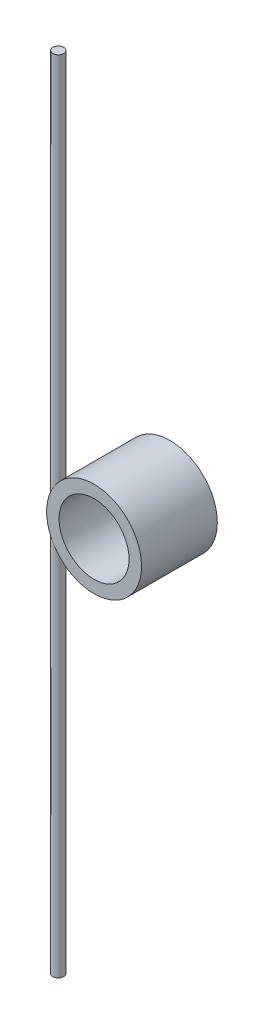
ISO-10303-21;
HEADER;
FILE_DESCRIPTION(('STEP AP214'),'2;1');
FILE_NAME('part.step','',(''),(''),'','','');
FILE_SCHEMA(('AUTOMOTIVE_DESIGN { 1 0 10303 214 1 1 1 1 }'));
ENDSEC;
DATA;
#1=APPLICATION_CONTEXT('core data for automotive mechanical design processes');
#2=APPLICATION_PROTOCOL_DEFINITION('international standard','automotive_design',2000,#1);
#3=PRODUCT_CONTEXT('',#1,'mechanical');
#4=PRODUCT('Part','Part','',(#3));
#5=PRODUCT_RELATED_PRODUCT_CATEGORY('part','',(#4));
#6=PRODUCT_DEFINITION_FORMATION('','',#4);
#7=PRODUCT_DEFINITION_CONTEXT('part definition',#1,'design');
#8=PRODUCT_DEFINITION('design','',#6,#7);
#9=PRODUCT_DEFINITION_SHAPE('','',#8);
#10=(LENGTH_UNIT() NAMED_UNIT(*) SI_UNIT(.MILLI.,.METRE.));
#11=(NAMED_UNIT(*) PLANE_ANGLE_UNIT() SI_UNIT($,.RADIAN.));
#12=(NAMED_UNIT(*) SI_UNIT($,.STERADIAN.) SOLID_ANGLE_UNIT());
#13=UNCERTAINTY_MEASURE_WITH_UNIT(LENGTH_MEASURE(1.E-05),#10,'distance_accuracy_value','');
#14=(GEOMETRIC_REPRESENTATION_CONTEXT(3) GLOBAL_UNCERTAINTY_ASSIGNED_CONTEXT((#13)) GLOBAL_UNIT_ASSIGNED_CONTEXT((#10,
#11,#12)) REPRESENTATION_CONTEXT('',''));
#15=CARTESIAN_POINT('',(0.,0.,0.));
#16=DIRECTION('',(0.,0.,1.));
#17=DIRECTION('',(1.,0.,0.));
#18=AXIS2_PLACEMENT_3D('',#15,#16,#17);
#19=CARTESIAN_POINT('',(0.,0.,9.1));
#20=DIRECTION('',(0.,0.,-1.));
#21=DIRECTION('',(-1.,0.,0.));
#22=AXIS2_PLACEMENT_3D('',#19,#20,#21);
#23=CYLINDRICAL_SURFACE('',#22,5.7);
#24=CARTESIAN_POINT('',(0.,0.,9.1));
#25=DIRECTION('',(0.,0.,1.));
#26=DIRECTION('',(1.,0.,0.));
#27=AXIS2_PLACEMENT_3D('',#24,#25,#26);
#28=CIRCLE('',#27,5.7);
#29=CARTESIAN_POINT('',(5.7,0.,9.1));
#30=VERTEX_POINT('',#29);
#31=EDGE_CURVE('E45',#30,#30,#28,.T.);
#32=ORIENTED_EDGE('',*,*,#31,.F.);
#33=EDGE_LOOP('',(#32));
#34=FACE_BOUND('',#33,.T.);
#35=CARTESIAN_POINT('',(0.,0.,0.));
#36=DIRECTION('',(0.,0.,1.));
#37=DIRECTION('',(1.,0.,0.));
#38=AXIS2_PLACEMENT_3D('',#35,#36,#37);
#39=CIRCLE('',#38,5.7);
#40=CARTESIAN_POINT('',(5.7,0.,0.));
#41=VERTEX_POINT('',#40);
#42=EDGE_CURVE('E49',#41,#41,#39,.T.);
#43=ORIENTED_EDGE('',*,*,#42,.T.);
#44=EDGE_LOOP('',(#43));
#45=FACE_BOUND('',#44,.T.);
#46=CARTESIAN_POINT('',(-4.94879537950155,-2.82832535112638,7.79469772045198));
#47=CARTESIAN_POINT('',(-4.92124851333679,-2.8765262572011,7.79470033685901));
#48=CARTESIAN_POINT('',(-4.89299681844802,-2.92432120577079,7.7964435548042));
#49=CARTESIAN_POINT('',(-4.83526502378138,-3.01881950734765,7.80402686229091));
#50=CARTESIAN_POINT('',(-4.80578567119856,-3.06552349809084,7.80986449314195));
#51=CARTESIAN_POINT('',(-4.74607647568734,-3.15717122755494,7.82634629996955));
#52=CARTESIAN_POINT('',(-4.71585270588232,-3.20212438308667,7.83695920477175));
#53=CARTESIAN_POINT('',(-4.65500668526824,-3.28994726703184,7.86392705802849));
#54=CARTESIAN_POINT('',(-4.62438521480376,-3.33282046721021,7.88027203506012));
#55=CARTESIAN_POINT('',(-4.5716709227661,-3.40459258649678,7.91461745051126));
#56=CARTESIAN_POINT('',(-4.54947619078738,-3.43417506284755,7.93102095441509));
#57=CARTESIAN_POINT('',(-4.50583718719972,-3.49123464490253,7.96813773965589));
#58=CARTESIAN_POINT('',(-4.48439381939529,-3.51870925933989,7.98885601639834));
#59=CARTESIAN_POINT('',(-4.44287497017751,-3.57099257349622,8.03539468392058));
#60=CARTESIAN_POINT('',(-4.42281766599221,-3.5957676720686,8.06127003806035));
#61=CARTESIAN_POINT('',(-4.38563731953586,-3.64102172532859,8.11834845748735));
#62=CARTESIAN_POINT('',(-4.36850577752881,-3.66151316487559,8.14953554539927));
#63=CARTESIAN_POINT('',(-4.34397103093535,-3.69054820603911,8.20538312979634));
#64=CARTESIAN_POINT('',(-4.33524974937269,-3.70077574172137,8.22858959575401));
#65=CARTESIAN_POINT('',(-4.3203231327969,-3.7181903642618,8.27688971333378));
#66=CARTESIAN_POINT('',(-4.31411596888323,-3.72537966145915,8.30198197731716));
#67=CARTESIAN_POINT('',(-4.30466662899864,-3.73629485253635,8.35364069642469));
#68=CARTESIAN_POINT('',(-4.30144393728129,-3.73999798943012,8.38021565463077));
#69=CARTESIAN_POINT('',(-4.29833315296337,-3.74357295191633,8.43381612134176));
#70=CARTESIAN_POINT('',(-4.29844388077277,-3.74344613280706,8.46084146708557));
#71=CARTESIAN_POINT('',(-4.30181249215778,-3.7395740242035,8.51179933392023));
#72=CARTESIAN_POINT('',(-4.30476792222427,-3.73617647882029,8.53578015835089));
#73=CARTESIAN_POINT('',(-4.31316445921064,-3.72647998323459,8.58268827712408));
#74=CARTESIAN_POINT('',(-4.31860591987286,-3.72018062012551,8.60561542102513));
#75=CARTESIAN_POINT('',(-4.33187077708896,-3.704726987159,8.65080501396899));
#76=CARTESIAN_POINT('',(-4.33977778642268,-3.69547217218979,8.67300792086484));
#77=CARTESIAN_POINT('',(-4.35743823646615,-3.67463186045865,8.71548720335274));
#78=CARTESIAN_POINT('',(-4.36719257670335,-3.66304522808359,8.7357626331371));
#79=CARTESIAN_POINT('',(-4.39410855217053,-3.63076618658358,8.78529958842596));
#80=CARTESIAN_POINT('',(-4.41231667997157,-3.60865514576019,8.81307109198096));
#81=CARTESIAN_POINT('',(-4.45087999817607,-3.56098533953717,8.86374349224674));
#82=CARTESIAN_POINT('',(-4.47124079711085,-3.53541751711706,8.88663117255392));
#83=CARTESIAN_POINT('',(-4.52424854213626,-3.46754497055275,8.93895863557525));
#84=CARTESIAN_POINT('',(-4.5576753145573,-3.42356561324928,8.96541813191384));
#85=CARTESIAN_POINT('',(-4.62507311942515,-3.33196036848324,9.00979518385072));
#86=CARTESIAN_POINT('',(-4.65904496323699,-3.28432854893602,9.0276984868315));
#87=CARTESIAN_POINT('',(-4.72115796307496,-3.19424200969413,9.05431726253125));
#88=CARTESIAN_POINT('',(-4.74938607703254,-3.1521304688083,9.06402720509619));
#89=CARTESIAN_POINT('',(-4.80504124392362,-3.06662491935996,9.07925772594726));
#90=CARTESIAN_POINT('',(-4.83246772988865,-3.02323004478253,9.08477540496192));
#91=CARTESIAN_POINT('',(-4.91329497118844,-2.89139185246111,9.09601656062496));
#92=CARTESIAN_POINT('',(-4.96510304110078,-2.80149808788683,9.09637559161533));
#93=CARTESIAN_POINT('',(-5.05611258845041,-2.63315553747921,9.08715021162525));
#94=CARTESIAN_POINT('',(-5.09604333566495,-2.55499131073395,9.07903563058513));
#95=CARTESIAN_POINT('',(-5.17196208024369,-2.39759031579424,9.05647095545244));
#96=CARTESIAN_POINT('',(-5.20794669182725,-2.31835269110292,9.04201547322029));
#97=CARTESIAN_POINT('',(-5.27574497625712,-2.1596166091244,9.00776169134001));
#98=CARTESIAN_POINT('',(-5.30757277966778,-2.08012002981675,8.9879822312548));
#99=CARTESIAN_POINT('',(-5.36719525747142,-1.92104572138822,8.94352427500387));
#100=CARTESIAN_POINT('',(-5.39499280960378,-1.84146809143502,8.91884930451714));
#101=CARTESIAN_POINT('',(-5.43834642009035,-1.70810438110206,8.87305426336013));
#102=CARTESIAN_POINT('',(-5.45497869029612,-1.65418923197366,8.85331139101585));
#103=CARTESIAN_POINT('',(-5.48647492512364,-1.54652831170023,8.81090689998622));
#104=CARTESIAN_POINT('',(-5.50132666130221,-1.49278593335955,8.78822710101532));
#105=CARTESIAN_POINT('',(-5.52221301525858,-1.41277751598013,8.75112056482906));
#106=CARTESIAN_POINT('',(-5.52898388756347,-1.38603154886866,8.73813951385941));
#107=CARTESIAN_POINT('',(-5.54198822127414,-1.33308164638955,8.7108774118934));
#108=CARTESIAN_POINT('',(-5.54822198834093,-1.30687740926973,8.69659710992915));
#109=CARTESIAN_POINT('',(-5.56003206886698,-1.2556783150489,8.66639563366116));
#110=CARTESIAN_POINT('',(-5.56561476983786,-1.23067343574416,8.65049389910545));
#111=CARTESIAN_POINT('',(-5.57606377926216,-1.18241571487408,8.61605602704597));
#112=CARTESIAN_POINT('',(-5.58093357950002,-1.15915462600976,8.59753366818076));
#113=CARTESIAN_POINT('',(-5.58669388312997,-1.13088748682714,8.56973553636186));
#114=CARTESIAN_POINT('',(-5.58807917893372,-1.1240177686159,8.56248884121849));
#115=CARTESIAN_POINT('',(-5.59068749709387,-1.11097118002959,8.54733407444006));
#116=CARTESIAN_POINT('',(-5.59191021494241,-1.10479561305014,8.53942480572529));
#117=CARTESIAN_POINT('',(-5.59414852987315,-1.09340587100516,8.52274291694427));
#118=CARTESIAN_POINT('',(-5.59516122540677,-1.08820524869095,8.51396040353801));
#119=CARTESIAN_POINT('',(-5.59686436748978,-1.07941167488622,8.49559521436894));
#120=CARTESIAN_POINT('',(-5.59755601989264,-1.07581270963057,8.48601569482936));
#121=CARTESIAN_POINT('',(-5.59836612970967,-1.07158752845284,8.4692938441608));
#122=CARTESIAN_POINT('',(-5.59859523598532,-1.0703885681146,8.46230305878425));
#123=CARTESIAN_POINT('',(-5.59882388975952,-1.06919198143043,8.4482162381305));
#124=CARTESIAN_POINT('',(-5.59882360866237,-1.0691934580863,8.441120285402));
#125=CARTESIAN_POINT('',(-5.59859386140054,-1.07039575514557,8.42704967441099));
#126=CARTESIAN_POINT('',(-5.59836476533617,-1.07159463878445,8.42007483878047));
#127=CARTESIAN_POINT('',(-5.59770254230395,-1.07504851813043,8.40640277488163));
#128=CARTESIAN_POINT('',(-5.5972691835911,-1.07730471338734,8.39970587135338));
#129=CARTESIAN_POINT('',(-5.59595035761881,-1.0841388360205,8.38311078368416));
#130=CARTESIAN_POINT('',(-5.59494727658746,-1.08931151256589,8.37346983072123));
#131=CARTESIAN_POINT('',(-5.5926559709314,-1.10101576489337,8.35509097694791));
#132=CARTESIAN_POINT('',(-5.59136684506274,-1.10755163169448,8.34635606136041));
#133=CARTESIAN_POINT('',(-5.58640968711274,-1.13240938712732,8.31652361298124));
#134=CARTESIAN_POINT('',(-5.58218583974029,-1.1531172141332,8.2975610122532));
#135=CARTESIAN_POINT('',(-5.57300677844195,-1.19670786097318,8.26253596718375));
#136=CARTESIAN_POINT('',(-5.56804655969142,-1.2196051495313,8.24649518814751));
#137=CARTESIAN_POINT('',(-5.5579238314683,-1.26490401729854,8.2173595981538));
#138=CARTESIAN_POINT('',(-5.55279848571892,-1.28723201627541,8.20413822840966));
#139=CARTESIAN_POINT('',(-5.54211997639285,-1.33245963018106,8.17889136629958));
#140=CARTESIAN_POINT('',(-5.53656651210651,-1.35535963911448,8.16686672835058));
#141=CARTESIAN_POINT('',(-5.51928916306925,-1.4246798482347,8.13210965921687));
#142=CARTESIAN_POINT('',(-5.5069669405393,-1.47163623128386,8.11074434902362));
#143=CARTESIAN_POINT('',(-5.48080922197726,-1.56625366675933,8.07048743091567));
#144=CARTESIAN_POINT('',(-5.46697124802332,-1.61391575948527,8.05159998794959));
#145=CARTESIAN_POINT('',(-5.43783928196491,-1.70950225623035,8.01590231197669));
#146=CARTESIAN_POINT('',(-5.4225469205329,-1.75742631099259,7.9990898000392));
#147=CARTESIAN_POINT('',(-5.3777627608962,-1.89153556959811,7.95466449900609));
#148=CARTESIAN_POINT('',(-5.3466440403414,-1.97786240742334,7.9290858649624));
#149=CARTESIAN_POINT('',(-5.27965192297051,-2.15031323344087,7.88374619360525));
#150=CARTESIAN_POINT('',(-5.24377336612051,-2.23643689675913,7.86399154591952));
#151=CARTESIAN_POINT('',(-5.16732899302542,-2.40780121863668,7.83112342691818));
#152=CARTESIAN_POINT('',(-5.12676714195615,-2.49304255854952,7.81800438738728));
#153=CARTESIAN_POINT('',(-5.04108711758336,-2.66202677328404,7.79979455985819));
#154=CARTESIAN_POINT('',(-4.9959750048604,-2.74577147087876,7.79469323932142));
#155=CARTESIAN_POINT('',(-4.94879537950155,-2.82832535112638,7.79469772045198));
#156=B_SPLINE_CURVE_WITH_KNOTS('',3,(#46,#47,#48,#49,#50,#51,#52,#53,#54,#55,#56,#57,#58,#59,
#60,#61,#62,#63,#64,#65,#66,#67,#68,#69,#70,#71,#72,#73,#74,#75,#76,#77,#78,#79,#80,#81,#82,#83,
#84,#85,#86,#87,#88,#89,#90,#91,#92,#93,#94,#95,#96,#97,#98,#99,#100,#101,#102,#103,#104,#105,
#106,#107,#108,#109,#110,#111,#112,#113,#114,#115,#116,#117,#118,#119,#120,#121,#122,#123,#124,
#125,#126,#127,#128,#129,#130,#131,#132,#133,#134,#135,#136,#137,#138,#139,#140,#141,#142,#143,
#144,#145,#146,#147,#148,#149,#150,#151,#152,#153,#154,#155),.UNSPECIFIED.,.T.,.F.,(4,2,2,2,2,2,
2,2,2,2,2,2,2,2,2,2,2,2,2,2,2,2,2,2,2,2,2,2,2,2,2,2,2,2,2,2,2,2,2,2,2,2,2,2,2,2,2,2,2,2,2,2,2,2,
4),(0.,0.166503476072709,0.332907052498688,0.498236436272624,0.663279630727456,
0.784420114242325,0.905701635045758,1.02835245899924,1.15064066973853,1.23079119465984,
1.31088330872837,1.3914946955825,1.47207755699339,1.54494211222657,1.61781703873547,
1.69349667923699,1.76921326588921,1.88821986955362,2.00754455050905,2.19027107524005,
2.37330092778256,2.52793683550391,2.68267958870652,2.99291433369893,3.25704306834363,
3.52139668076757,3.7848268705917,4.04806802583694,4.2273296004735,4.407759242339,
4.49920966967206,4.5906077049495,4.68101617228776,4.77096583332406,4.80117499448574,
4.83143996333469,4.86209867310158,4.89264127638435,4.91383483450926,4.93501255626298,
4.95615607916544,4.97732364828056,5.01009322398351,5.04296755134275,5.12748412042437,
5.21260391079232,5.29188988589625,5.37123206782162,5.53021441746446,5.68946066085116,
5.84853041484485,6.13400516409219,6.419791958481,6.70533853773725,6.99050969205559),.UNSPECIFIED.);
#157=CARTESIAN_POINT('',(-4.94879537950155,-2.82832535112638,7.79469772045198));
#158=VERTEX_POINT('',#157);
#159=EDGE_CURVE('E41',#158,#158,#156,.T.);
#160=ORIENTED_EDGE('',*,*,#159,.F.);
#161=EDGE_LOOP('',(#160));
#162=FACE_BOUND('',#161,.T.);
#163=CARTESIAN_POINT('',(-4.94879537950155,2.82832535112638,7.79469772045198));
#164=CARTESIAN_POINT('',(-4.98932470605339,2.75740921352501,7.79469594456186));
#165=CARTESIAN_POINT('',(-5.02832535647001,2.68562142917145,7.79846579607338));
#166=CARTESIAN_POINT('',(-5.10300499257803,2.54086356375439,7.81211542645055));
#167=CARTESIAN_POINT('',(-5.13868059551391,2.46789236543616,7.8220013511223));
#168=CARTESIAN_POINT('',(-5.20668774074273,2.3209857967204,7.84694529624669));
#169=CARTESIAN_POINT('',(-5.23900758700773,2.24704800297508,7.86202066483731));
#170=CARTESIAN_POINT('',(-5.30012128005733,2.09884232267187,7.89669849178112));
#171=CARTESIAN_POINT('',(-5.32891701750716,2.02457463546062,7.91629850625042));
#172=CARTESIAN_POINT('',(-5.38470540304561,1.87136144040934,7.96111978892291));
#173=CARTESIAN_POINT('',(-5.41147327711835,1.79241333415031,7.98661558650918));
#174=CARTESIAN_POINT('',(-5.44861759584139,1.67459223949693,8.02873617825882));
#175=CARTESIAN_POINT('',(-5.46048268948433,1.63547523213981,8.04339837304561));
#176=CARTESIAN_POINT('',(-5.48322029175846,1.55754294201003,8.07421392340839));
#177=CARTESIAN_POINT('',(-5.49409301063905,1.51872759692744,8.09036696166158));
#178=CARTESIAN_POINT('',(-5.51235166671116,1.45082883041597,8.12045202639557));
#179=CARTESIAN_POINT('',(-5.51995102533873,1.42163075677574,8.13399587520678));
#180=CARTESIAN_POINT('',(-5.53455264760433,1.36367865858948,8.16248092398768));
#181=CARTESIAN_POINT('',(-5.54155364051584,1.33492568029316,8.17742496308623));
#182=CARTESIAN_POINT('',(-5.55453452739397,1.27980747615726,8.20837859622147));
#183=CARTESIAN_POINT('',(-5.56054867612928,1.25339602083031,8.2242915759888));
#184=CARTESIAN_POINT('',(-5.57185723741102,1.2021158758938,8.25861710669199));
#185=CARTESIAN_POINT('',(-5.57715442016372,1.17724146261459,8.27701945365964));
#186=CARTESIAN_POINT('',(-5.58359767527324,1.14608348125737,8.30477402183788));
#187=CARTESIAN_POINT('',(-5.58520337355344,1.13822799761929,8.31223091841346));
#188=CARTESIAN_POINT('',(-5.58825355278444,1.12315660323805,8.3278343696407));
#189=CARTESIAN_POINT('',(-5.58969773260199,1.11594189213315,8.33598216428061));
#190=CARTESIAN_POINT('',(-5.59238293966821,1.10240700857769,8.35319920092791));
#191=CARTESIAN_POINT('',(-5.59362132350589,1.09609859881631,8.36227831974999));
#192=CARTESIAN_POINT('',(-5.5957749012754,1.08505066866587,8.38138227168738));
#193=CARTESIAN_POINT('',(-5.59669133820901,1.08030511878805,8.39140327389403));
#194=CARTESIAN_POINT('',(-5.59782991751624,1.07438634609666,8.40863527587448));
#195=CARTESIAN_POINT('',(-5.59818276625167,1.07254429637997,8.41560481678348));
#196=CARTESIAN_POINT('',(-5.59866210009895,1.07003943412889,8.4297592131167));
#197=CARTESIAN_POINT('',(-5.59878887263065,1.06937512429229,8.43694378332613));
#198=CARTESIAN_POINT('',(-5.59880140537345,1.06930951023816,8.45133327001091));
#199=CARTESIAN_POINT('',(-5.59868669110445,1.06991069249518,8.45853819871231));
#200=CARTESIAN_POINT('',(-5.59822916069854,1.07230204439796,8.47274165144835));
#201=CARTESIAN_POINT('',(-5.59788606225268,1.07409368558213,8.47973990881823));
#202=CARTESIAN_POINT('',(-5.59684531359112,1.0795056305085,8.49586724496106));
#203=CARTESIAN_POINT('',(-5.59606407446731,1.08355413826978,8.50484494942757));
#204=CARTESIAN_POINT('',(-5.5942344799009,1.09296102717209,8.5220516093615));
#205=CARTESIAN_POINT('',(-5.59318542498154,1.09832283686209,8.53027852636396));
#206=CARTESIAN_POINT('',(-5.58985498772787,1.11518875697171,8.55321275121507));
#207=CARTESIAN_POINT('',(-5.58731985964633,1.12784785695349,8.56701769153753));
#208=CARTESIAN_POINT('',(-5.58182114574475,1.15475794181472,8.59285872834185));
#209=CARTESIAN_POINT('',(-5.57885603793515,1.16901453876929,8.6048882215898));
#210=CARTESIAN_POINT('',(-5.56998820195952,1.21078071452204,8.63730740482845));
#211=CARTESIAN_POINT('',(-5.56371294544414,1.23934820399896,8.65621488871713));
#212=CARTESIAN_POINT('',(-5.55037195149234,1.29779920333993,8.6915930073527));
#213=CARTESIAN_POINT('',(-5.54330413712143,1.32768604035903,8.70805696374703));
#214=CARTESIAN_POINT('',(-5.5284270826534,1.38833454326293,8.73936552607412));
#215=CARTESIAN_POINT('',(-5.52061396584459,1.41910012704703,8.75420069315576));
#216=CARTESIAN_POINT('',(-5.50433031101166,1.48100395544728,8.78255403638858));
#217=CARTESIAN_POINT('',(-5.49586058187923,1.51214170279549,8.79607378811526));
#218=CARTESIAN_POINT('',(-5.47483422814732,1.58689292175795,8.82713759044401));
#219=CARTESIAN_POINT('',(-5.46197405700258,1.6306260498881,8.8441893418684));
#220=CARTESIAN_POINT('',(-5.43501769432573,1.71833957746954,8.87658907973497));
#221=CARTESIAN_POINT('',(-5.42092134136163,1.76232000851197,8.8919368430599));
#222=CARTESIAN_POINT('',(-5.37674322872116,1.89453621313313,8.93570415942246));
#223=CARTESIAN_POINT('',(-5.34480313940872,1.98293693822083,8.96180341380905));
#224=CARTESIAN_POINT('',(-5.27614293301743,2.15898346619195,9.00775737768624));
#225=CARTESIAN_POINT('',(-5.23944632055109,2.246630859077,9.02764125287838));
#226=CARTESIAN_POINT('',(-5.16117211365548,2.42103838733605,9.06048816912869));
#227=CARTESIAN_POINT('',(-5.11959645535109,2.50779885990332,9.07345394420522));
#228=CARTESIAN_POINT('',(-5.03411385400076,2.67507626825934,9.09046445643444));
#229=CARTESIAN_POINT('',(-4.99045983246864,2.75567465581657,9.09495947122544));
#230=CARTESIAN_POINT('',(-4.89925003405396,2.91474320809782,9.09441208235852));
#231=CARTESIAN_POINT('',(-4.85169392466714,2.99321319069681,9.08936886512082));
#232=CARTESIAN_POINT('',(-4.76282074808207,3.13225722216132,9.06886697580724));
#233=CARTESIAN_POINT('',(-4.72199068556579,3.19344298099359,9.05552242956589));
#234=CARTESIAN_POINT('',(-4.63959184421033,3.31199880744253,9.01822733905767));
#235=CARTESIAN_POINT('',(-4.59802547784196,3.36937916518353,8.99430686045413));
#236=CARTESIAN_POINT('',(-4.53456939837323,3.45385832517176,8.94641885101807));
#237=CARTESIAN_POINT('',(-4.51208540347873,3.48315279709425,8.92712321979984));
#238=CARTESIAN_POINT('',(-4.46840952757121,3.53900576086679,8.88364904018443));
#239=CARTESIAN_POINT('',(-4.4472165089689,3.56556667614761,8.85947487414545));
#240=CARTESIAN_POINT('',(-4.41123077212183,3.60994370598198,8.8110898205358));
#241=CARTESIAN_POINT('',(-4.39600326247963,3.62844855260631,8.78784167725217));
#242=CARTESIAN_POINT('',(-4.36792325754802,3.662202444089,8.73779695806198));
#243=CARTESIAN_POINT('',(-4.35506729288217,3.67745625011556,8.71100566567869));
#244=CARTESIAN_POINT('',(-4.33504438155431,3.70102401644467,8.66008981889932));
#245=CARTESIAN_POINT('',(-4.32725000798625,3.71012207357862,8.6365777420972));
#246=CARTESIAN_POINT('',(-4.31426406079875,3.72521481181144,8.58788687126507));
#247=CARTESIAN_POINT('',(-4.30907079260957,3.73121151346647,8.56270917449124));
#248=CARTESIAN_POINT('',(-4.30167929470856,3.73973106076013,8.51118856565948));
#249=CARTESIAN_POINT('',(-4.29949736720234,3.74223499873535,8.48484010219137));
#250=CARTESIAN_POINT('',(-4.298382804505,3.74351523668596,8.43198505803498));
#251=CARTESIAN_POINT('',(-4.29944948095533,3.74229232635682,8.40547851203124));
#252=CARTESIAN_POINT('',(-4.30450162619601,3.73647934569669,8.35545966543319));
#253=CARTESIAN_POINT('',(-4.30822970192568,3.7321861518902,8.33188514550804));
#254=CARTESIAN_POINT('',(-4.31804412417063,3.72082665350198,8.28593478726754));
#255=CARTESIAN_POINT('',(-4.32413122290575,3.71375946436925,8.26355933389073));
#256=CARTESIAN_POINT('',(-4.34043353825759,3.69470376424864,8.21389753191891));
#257=CARTESIAN_POINT('',(-4.35133987693434,3.68187414949387,8.18716127447007));
#258=CARTESIAN_POINT('',(-4.37566242989349,3.65293537380913,8.13679390646099));
#259=CARTESIAN_POINT('',(-4.38908288188372,3.63682067153704,8.11316815507017));
#260=CARTESIAN_POINT('',(-4.42343786418877,3.59502248476598,8.06017145611668));
#261=CARTESIAN_POINT('',(-4.44521866989807,3.56810233199824,8.0323314582147));
#262=CARTESIAN_POINT('',(-4.49063679251797,3.5107737940871,7.98238390925138));
#263=CARTESIAN_POINT('',(-4.5142778384995,3.48035834299197,7.96028827553165));
#264=CARTESIAN_POINT('',(-4.57640408787241,3.3985963837625,7.90968069721015));
#265=CARTESIAN_POINT('',(-4.61550125556266,3.34539277105706,7.88494851697944));
#266=CARTESIAN_POINT('',(-4.69334513313994,3.23528949192377,7.84540418623963));
#267=CARTESIAN_POINT('',(-4.73209118240032,3.17838404945384,7.83060796700117));
#268=CARTESIAN_POINT('',(-4.80108763428287,3.07290885374177,7.81088570799996));
#269=CARTESIAN_POINT('',(-4.83158809242295,3.02473489152536,7.80464345630385));
#270=CARTESIAN_POINT('',(-4.89124012595386,2.92729093460442,7.79655244364269));
#271=CARTESIAN_POINT('',(-4.92039311671003,2.87802217433259,7.79469896496557));
#272=CARTESIAN_POINT('',(-4.94879537950155,2.82832535112638,7.79469772045198));
#273=B_SPLINE_CURVE_WITH_KNOTS('',3,(#163,#164,#165,#166,#167,#168,#169,#170,#171,#172,#173,
#174,#175,#176,#177,#178,#179,#180,#181,#182,#183,#184,#185,#186,#187,#188,#189,#190,#191,#192,
#193,#194,#195,#196,#197,#198,#199,#200,#201,#202,#203,#204,#205,#206,#207,#208,#209,#210,#211,
#212,#213,#214,#215,#216,#217,#218,#219,#220,#221,#222,#223,#224,#225,#226,#227,#228,#229,#230,
#231,#232,#233,#234,#235,#236,#237,#238,#239,#240,#241,#242,#243,#244,#245,#246,#247,#248,#249,
#250,#251,#252,#253,#254,#255,#256,#257,#258,#259,#260,#261,#262,#263,#264,#265,#266,#267,#268,
#269,#270,#271,#272),.UNSPECIFIED.,.T.,.F.,(4,2,2,2,2,2,2,2,2,2,2,2,2,2,2,2,2,2,2,2,2,2,2,2,2,2,
2,2,2,2,2,2,2,2,2,2,2,2,2,2,2,2,2,2,2,2,2,2,2,2,2,2,2,2,4),(0.,0.244971979793396,
0.49019052321117,0.736236915603623,0.982150721331526,1.2434158153312,1.37366965099894,
1.5038958260777,1.60308520568847,1.70248025090539,1.79667657736456,1.8904978730715,
1.92331694400752,1.95619621686512,1.98946971168458,2.02261329161786,2.04417724659499,
2.06571376684332,2.08729264214766,2.10889824106616,2.13836647119872,2.16791246772144,
2.22429937469505,2.28089097894619,2.38509946507538,2.48958771421912,2.59465264412382,
2.69959013900188,2.84554034968629,2.99150964835507,3.28381456898253,3.57472650872408,
3.86552339537537,4.14037137057534,4.41524279045998,4.63893499472846,4.86199532671663,
4.98669585311153,5.11128485644661,5.21110496942617,5.31077787517304,5.38962433849,
5.46841936783191,5.54763931086894,5.62684246887081,5.69927276991466,5.77172618578135,
5.86599681431535,5.96042779588611,6.09297992341215,6.22580488976888,6.43613824102163,
6.64680803957569,6.81866505869034,6.99033725604973),.UNSPECIFIED.);
#274=CARTESIAN_POINT('',(-4.94879537950155,2.82832535112638,7.79469772045198));
#275=VERTEX_POINT('',#274);
#276=EDGE_CURVE('E10',#275,#275,#273,.T.);
#277=ORIENTED_EDGE('',*,*,#276,.F.);
#278=EDGE_LOOP('',(#277));
#279=FACE_BOUND('',#278,.T.);
#280=ADVANCED_FACE('F31',(#34,#45,#162,#279),#23,.T.);
#281=CARTESIAN_POINT('',(0.,0.,9.1));
#282=DIRECTION('',(0.,0.,1.));
#283=DIRECTION('',(1.,0.,0.));
#284=AXIS2_PLACEMENT_3D('',#281,#282,#283);
#285=PLANE('',#284);
#286=ORIENTED_EDGE('',*,*,#31,.T.);
#287=EDGE_LOOP('',(#286));
#288=FACE_BOUND('',#287,.T.);
#289=CARTESIAN_POINT('',(0.,0.,9.1));
#290=DIRECTION('',(0.,0.,1.));
#291=DIRECTION('',(1.,0.,0.));
#292=AXIS2_PLACEMENT_3D('',#289,#290,#291);
#293=CIRCLE('',#292,4.2);
#294=CARTESIAN_POINT('',(4.2,0.,9.1));
#295=VERTEX_POINT('',#294);
#296=EDGE_CURVE('E88',#295,#295,#293,.T.);
#297=ORIENTED_EDGE('',*,*,#296,.F.);
#298=EDGE_LOOP('',(#297));
#299=FACE_BOUND('',#298,.T.);
#300=ADVANCED_FACE('F70',(#288,#299),#285,.T.);
#301=CARTESIAN_POINT('',(0.,0.,0.));
#302=DIRECTION('',(0.,0.,1.));
#303=DIRECTION('',(1.,0.,0.));
#304=AXIS2_PLACEMENT_3D('',#301,#302,#303);
#305=PLANE('',#304);
#306=ORIENTED_EDGE('',*,*,#42,.F.);
#307=EDGE_LOOP('',(#306));
#308=FACE_BOUND('',#307,.T.);
#309=CARTESIAN_POINT('',(0.,0.,0.));
#310=DIRECTION('',(0.,0.,1.));
#311=DIRECTION('',(1.,0.,0.));
#312=AXIS2_PLACEMENT_3D('',#309,#310,#311);
#313=CIRCLE('',#312,4.2);
#314=CARTESIAN_POINT('',(4.2,0.,0.));
#315=VERTEX_POINT('',#314);
#316=EDGE_CURVE('E90',#315,#315,#313,.T.);
#317=ORIENTED_EDGE('',*,*,#316,.T.);
#318=EDGE_LOOP('',(#317));
#319=FACE_BOUND('',#318,.T.);
#320=ADVANCED_FACE('F68',(#308,#319),#305,.F.);
#321=CARTESIAN_POINT('',(0.,0.,9.1));
#322=DIRECTION('',(0.,0.,-1.));
#323=DIRECTION('',(-1.,0.,0.));
#324=AXIS2_PLACEMENT_3D('',#321,#322,#323);
#325=CYLINDRICAL_SURFACE('',#324,4.2);
#326=ORIENTED_EDGE('',*,*,#296,.T.);
#327=EDGE_LOOP('',(#326));
#328=FACE_BOUND('',#327,.T.);
#329=ORIENTED_EDGE('',*,*,#316,.F.);
#330=EDGE_LOOP('',(#329));
#331=FACE_BOUND('',#330,.T.);
#332=ADVANCED_FACE('F64',(#328,#331),#325,.F.);
#333=CARTESIAN_POINT('',(-4.94879537950155,-48.,8.44469772045198));
#334=DIRECTION('',(0.,1.,0.));
#335=DIRECTION('',(0.,0.,1.));
#336=AXIS2_PLACEMENT_3D('',#333,#334,#335);
#337=PLANE('',#336);
#338=CARTESIAN_POINT('',(-4.94879537950155,-48.,8.44469772045198));
#339=DIRECTION('',(0.,1.,0.));
#340=DIRECTION('',(0.,0.,1.));
#341=AXIS2_PLACEMENT_3D('',#338,#339,#340);
#342=CIRCLE('',#341,0.65);
#343=CARTESIAN_POINT('',(-4.94879537950155,-48.,9.09469772045198));
#344=VERTEX_POINT('',#343);
#345=EDGE_CURVE('E97',#344,#344,#342,.T.);
#346=ORIENTED_EDGE('',*,*,#345,.F.);
#347=EDGE_LOOP('',(#346));
#348=FACE_BOUND('',#347,.T.);
#349=ADVANCED_FACE('F62',(#348),#337,.F.);
#350=CARTESIAN_POINT('',(-4.94879537950155,48.,8.44469772045198));
#351=DIRECTION('',(0.,-1.,0.));
#352=DIRECTION('',(0.,0.,-1.));
#353=AXIS2_PLACEMENT_3D('',#350,#351,#352);
#354=CYLINDRICAL_SURFACE('',#353,0.65);
#355=ORIENTED_EDGE('',*,*,#345,.T.);
#356=EDGE_LOOP('',(#355));
#357=FACE_BOUND('',#356,.T.);
#358=ORIENTED_EDGE('',*,*,#159,.T.);
#359=EDGE_LOOP('',(#358));
#360=FACE_BOUND('',#359,.T.);
#361=ADVANCED_FACE('F60',(#357,#360),#354,.T.);
#362=CARTESIAN_POINT('',(-4.94879537950155,48.,8.44469772045198));
#363=DIRECTION('',(0.,1.,0.));
#364=DIRECTION('',(0.,0.,1.));
#365=AXIS2_PLACEMENT_3D('',#362,#363,#364);
#366=CIRCLE('',#365,0.65);
#367=CARTESIAN_POINT('',(-4.94879537950155,48.,9.09469772045198));
#368=VERTEX_POINT('',#367);
#369=EDGE_CURVE('E94',#368,#368,#366,.T.);
#370=ORIENTED_EDGE('',*,*,#369,.F.);
#371=EDGE_LOOP('',(#370));
#372=FACE_BOUND('',#371,.T.);
#373=ORIENTED_EDGE('',*,*,#276,.T.);
#374=EDGE_LOOP('',(#373));
#375=FACE_BOUND('',#374,.T.);
#376=ADVANCED_FACE('F54',(#372,#375),#354,.T.);
#377=CARTESIAN_POINT('',(-4.94879537950155,48.,8.44469772045198));
#378=DIRECTION('',(0.,1.,0.));
#379=DIRECTION('',(0.,0.,1.));
#380=AXIS2_PLACEMENT_3D('',#377,#378,#379);
#381=PLANE('',#380);
#382=ORIENTED_EDGE('',*,*,#369,.T.);
#383=EDGE_LOOP('',(#382));
#384=FACE_BOUND('',#383,.T.);
#385=ADVANCED_FACE('F59',(#384),#381,.T.);
#386=CLOSED_SHELL('',(#280,#300,#320,#332,#349,#361,#376,#385));
#387=MANIFOLD_SOLID_BREP('B2',#386);
#388=ADVANCED_BREP_SHAPE_REPRESENTATION('',(#18,#387),#14);
#389=SHAPE_DEFINITION_REPRESENTATION(#9,#388);
ENDSEC;
END-ISO-10303-21;
